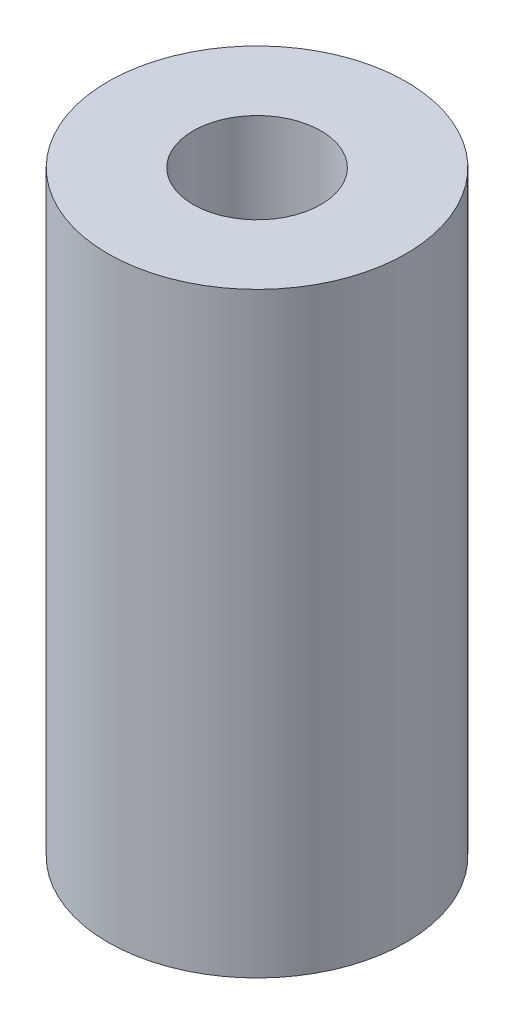
ISO-10303-21;
HEADER;
FILE_DESCRIPTION(('STEP AP214'),'2;1');
FILE_NAME('part.step','',(''),(''),'','','');
FILE_SCHEMA(('AUTOMOTIVE_DESIGN { 1 0 10303 214 1 1 1 1 }'));
ENDSEC;
DATA;
#1=APPLICATION_CONTEXT('core data for automotive mechanical design processes');
#2=APPLICATION_PROTOCOL_DEFINITION('international standard','automotive_design',2000,#1);
#3=PRODUCT_CONTEXT('',#1,'mechanical');
#4=PRODUCT('Part','Part','',(#3));
#5=PRODUCT_RELATED_PRODUCT_CATEGORY('part','',(#4));
#6=PRODUCT_DEFINITION_FORMATION('','',#4);
#7=PRODUCT_DEFINITION_CONTEXT('part definition',#1,'design');
#8=PRODUCT_DEFINITION('design','',#6,#7);
#9=PRODUCT_DEFINITION_SHAPE('','',#8);
#10=(LENGTH_UNIT() NAMED_UNIT(*) SI_UNIT(.MILLI.,.METRE.));
#11=(NAMED_UNIT(*) PLANE_ANGLE_UNIT() SI_UNIT($,.RADIAN.));
#12=(NAMED_UNIT(*) SI_UNIT($,.STERADIAN.) SOLID_ANGLE_UNIT());
#13=UNCERTAINTY_MEASURE_WITH_UNIT(LENGTH_MEASURE(1.E-05),#10,'distance_accuracy_value','');
#14=(GEOMETRIC_REPRESENTATION_CONTEXT(3) GLOBAL_UNCERTAINTY_ASSIGNED_CONTEXT((#13)) GLOBAL_UNIT_ASSIGNED_CONTEXT((#10,
#11,#12)) REPRESENTATION_CONTEXT('',''));
#15=CARTESIAN_POINT('',(0.,0.,0.));
#16=DIRECTION('',(0.,0.,1.));
#17=DIRECTION('',(1.,0.,0.));
#18=AXIS2_PLACEMENT_3D('',#15,#16,#17);
#19=CARTESIAN_POINT('',(0.,14.,0.));
#20=DIRECTION('',(0.,1.,0.));
#21=DIRECTION('',(0.,0.,1.));
#22=AXIS2_PLACEMENT_3D('',#19,#20,#21);
#23=PLANE('',#22);
#24=CARTESIAN_POINT('',(0.,14.,0.));
#25=DIRECTION('',(0.,1.,0.));
#26=DIRECTION('',(0.,0.,1.));
#27=AXIS2_PLACEMENT_3D('',#24,#25,#26);
#28=CIRCLE('',#27,3.5);
#29=CARTESIAN_POINT('',(0.,14.,3.5));
#30=VERTEX_POINT('',#29);
#31=EDGE_CURVE('E10',#30,#30,#28,.T.);
#32=ORIENTED_EDGE('',*,*,#31,.T.);
#33=EDGE_LOOP('',(#32));
#34=FACE_BOUND('',#33,.T.);
#35=CARTESIAN_POINT('',(0.,14.,0.));
#36=DIRECTION('',(0.,1.,0.));
#37=DIRECTION('',(0.,0.,1.));
#38=AXIS2_PLACEMENT_3D('',#35,#36,#37);
#39=CIRCLE('',#38,1.5);
#40=CARTESIAN_POINT('',(0.,14.,1.5));
#41=VERTEX_POINT('',#40);
#42=EDGE_CURVE('E42',#41,#41,#39,.T.);
#43=ORIENTED_EDGE('',*,*,#42,.F.);
#44=EDGE_LOOP('',(#43));
#45=FACE_BOUND('',#44,.T.);
#46=ADVANCED_FACE('F31',(#34,#45),#23,.T.);
#47=CARTESIAN_POINT('',(0.,0.,0.));
#48=DIRECTION('',(0.,1.,0.));
#49=DIRECTION('',(0.,0.,1.));
#50=AXIS2_PLACEMENT_3D('',#47,#48,#49);
#51=PLANE('',#50);
#52=CARTESIAN_POINT('',(0.,0.,0.));
#53=DIRECTION('',(0.,1.,0.));
#54=DIRECTION('',(0.,0.,1.));
#55=AXIS2_PLACEMENT_3D('',#52,#53,#54);
#56=CIRCLE('',#55,3.5);
#57=CARTESIAN_POINT('',(0.,0.,3.5));
#58=VERTEX_POINT('',#57);
#59=EDGE_CURVE('E35',#58,#58,#56,.T.);
#60=ORIENTED_EDGE('',*,*,#59,.F.);
#61=EDGE_LOOP('',(#60));
#62=FACE_BOUND('',#61,.T.);
#63=CARTESIAN_POINT('',(0.,0.,0.));
#64=DIRECTION('',(0.,1.,0.));
#65=DIRECTION('',(0.,0.,1.));
#66=AXIS2_PLACEMENT_3D('',#63,#64,#65);
#67=CIRCLE('',#66,1.5);
#68=CARTESIAN_POINT('',(0.,0.,1.5));
#69=VERTEX_POINT('',#68);
#70=EDGE_CURVE('E44',#69,#69,#67,.T.);
#71=ORIENTED_EDGE('',*,*,#70,.T.);
#72=EDGE_LOOP('',(#71));
#73=FACE_BOUND('',#72,.T.);
#74=ADVANCED_FACE('F54',(#62,#73),#51,.F.);
#75=CARTESIAN_POINT('',(0.,14.,0.));
#76=DIRECTION('',(0.,-1.,0.));
#77=DIRECTION('',(0.,0.,-1.));
#78=AXIS2_PLACEMENT_3D('',#75,#76,#77);
#79=CYLINDRICAL_SURFACE('',#78,3.5);
#80=ORIENTED_EDGE('',*,*,#31,.F.);
#81=EDGE_LOOP('',(#80));
#82=FACE_BOUND('',#81,.T.);
#83=ORIENTED_EDGE('',*,*,#59,.T.);
#84=EDGE_LOOP('',(#83));
#85=FACE_BOUND('',#84,.T.);
#86=ADVANCED_FACE('F33',(#82,#85),#79,.T.);
#87=CARTESIAN_POINT('',(0.,14.,0.));
#88=DIRECTION('',(0.,-1.,0.));
#89=DIRECTION('',(0.,0.,-1.));
#90=AXIS2_PLACEMENT_3D('',#87,#88,#89);
#91=CYLINDRICAL_SURFACE('',#90,1.5);
#92=ORIENTED_EDGE('',*,*,#42,.T.);
#93=EDGE_LOOP('',(#92));
#94=FACE_BOUND('',#93,.T.);
#95=ORIENTED_EDGE('',*,*,#70,.F.);
#96=EDGE_LOOP('',(#95));
#97=FACE_BOUND('',#96,.T.);
#98=ADVANCED_FACE('F50',(#94,#97),#91,.F.);
#99=CLOSED_SHELL('',(#46,#74,#86,#98));
#100=MANIFOLD_SOLID_BREP('B2',#99);
#101=ADVANCED_BREP_SHAPE_REPRESENTATION('',(#18,#100),#14);
#102=SHAPE_DEFINITION_REPRESENTATION(#9,#101);
ENDSEC;
END-ISO-10303-21;
